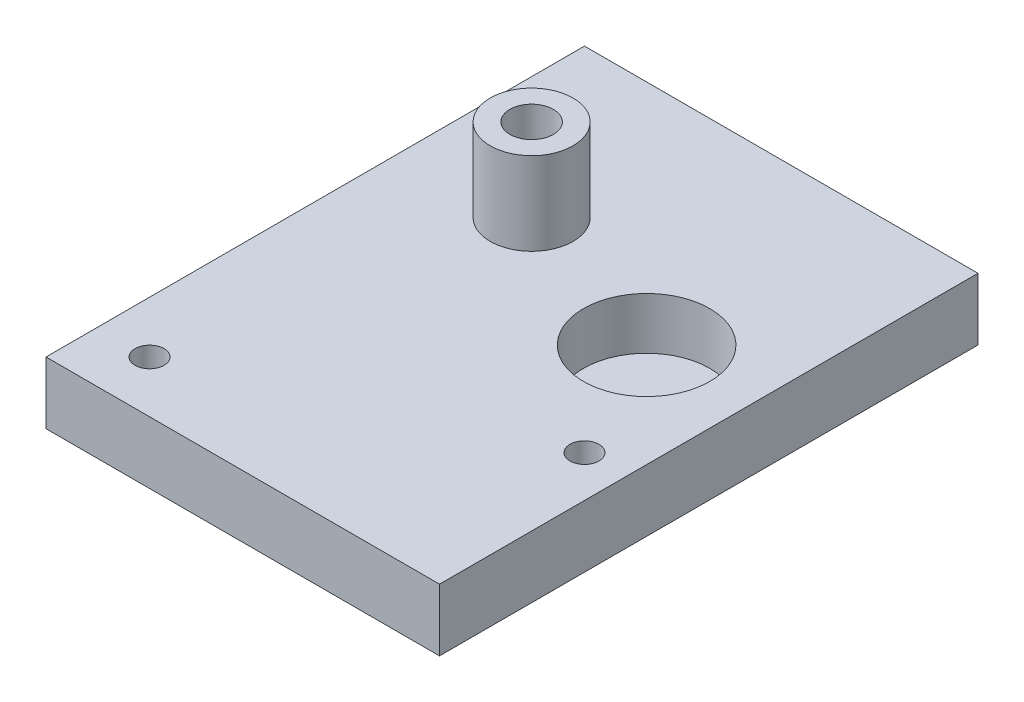
ISO-10303-21;
HEADER;
FILE_DESCRIPTION(('STEP AP214'),'2;1');
FILE_NAME('part.step','',(''),(''),'','','');
FILE_SCHEMA(('AUTOMOTIVE_DESIGN { 1 0 10303 214 1 1 1 1 }'));
ENDSEC;
DATA;
#1=APPLICATION_CONTEXT('core data for automotive mechanical design processes');
#2=APPLICATION_PROTOCOL_DEFINITION('international standard','automotive_design',2000,#1);
#3=PRODUCT_CONTEXT('',#1,'mechanical');
#4=PRODUCT('Part','Part','',(#3));
#5=PRODUCT_RELATED_PRODUCT_CATEGORY('part','',(#4));
#6=PRODUCT_DEFINITION_FORMATION('','',#4);
#7=PRODUCT_DEFINITION_CONTEXT('part definition',#1,'design');
#8=PRODUCT_DEFINITION('design','',#6,#7);
#9=PRODUCT_DEFINITION_SHAPE('','',#8);
#10=(LENGTH_UNIT() NAMED_UNIT(*) SI_UNIT(.MILLI.,.METRE.));
#11=(NAMED_UNIT(*) PLANE_ANGLE_UNIT() SI_UNIT($,.RADIAN.));
#12=(NAMED_UNIT(*) SI_UNIT($,.STERADIAN.) SOLID_ANGLE_UNIT());
#13=UNCERTAINTY_MEASURE_WITH_UNIT(LENGTH_MEASURE(1.E-05),#10,'distance_accuracy_value','');
#14=(GEOMETRIC_REPRESENTATION_CONTEXT(3) GLOBAL_UNCERTAINTY_ASSIGNED_CONTEXT((#13)) GLOBAL_UNIT_ASSIGNED_CONTEXT((#10,
#11,#12)) REPRESENTATION_CONTEXT('',''));
#15=CARTESIAN_POINT('',(0.,0.,0.));
#16=DIRECTION('',(0.,0.,1.));
#17=DIRECTION('',(1.,0.,0.));
#18=AXIS2_PLACEMENT_3D('',#15,#16,#17);
#19=CARTESIAN_POINT('',(-14.,3.,-11.));
#20=DIRECTION('',(0.,0.,-1.));
#21=DIRECTION('',(-1.,0.,0.));
#22=AXIS2_PLACEMENT_3D('',#19,#20,#21);
#23=PLANE('',#22);
#24=CARTESIAN_POINT('',(-4.2,1.5,-11.));
#25=DIRECTION('',(0.,0.,1.));
#26=DIRECTION('',(1.,0.,0.));
#27=AXIS2_PLACEMENT_3D('',#24,#25,#26);
#28=CIRCLE('',#27,0.300000000000001);
#29=CARTESIAN_POINT('',(-3.9,1.5,-11.));
#30=VERTEX_POINT('',#29);
#31=EDGE_CURVE('E178',#30,#30,#28,.T.);
#32=ORIENTED_EDGE('',*,*,#31,.T.);
#33=EDGE_LOOP('',(#32));
#34=FACE_BOUND('',#33,.T.);
#35=CARTESIAN_POINT('',(0.799999999999997,1.49999999999999,-11.));
#36=DIRECTION('',(0.,0.,1.));
#37=DIRECTION('',(1.,0.,0.));
#38=AXIS2_PLACEMENT_3D('',#35,#36,#37);
#39=CIRCLE('',#38,0.3);
#40=CARTESIAN_POINT('',(1.1,1.49999999999999,-11.));
#41=VERTEX_POINT('',#40);
#42=EDGE_CURVE('E181',#41,#41,#39,.T.);
#43=ORIENTED_EDGE('',*,*,#42,.T.);
#44=EDGE_LOOP('',(#43));
#45=FACE_BOUND('',#44,.T.);
#46=DIRECTION('',(1.,0.,0.));
#47=VECTOR('',#46,1.);
#48=CARTESIAN_POINT('',(-14.,0.,-11.));
#49=LINE('',#48,#47);
#50=CARTESIAN_POINT('',(-14.,0.,-11.));
#51=VERTEX_POINT('',#50);
#52=CARTESIAN_POINT('',(5.,0.,-11.));
#53=VERTEX_POINT('',#52);
#54=EDGE_CURVE('E104',#51,#53,#49,.T.);
#55=ORIENTED_EDGE('',*,*,#54,.F.);
#56=DIRECTION('',(0.,-1.,0.));
#57=VECTOR('',#56,1.);
#58=CARTESIAN_POINT('',(-14.,3.,-11.));
#59=LINE('',#58,#57);
#60=CARTESIAN_POINT('',(-14.,3.,-11.));
#61=VERTEX_POINT('',#60);
#62=EDGE_CURVE('E11',#61,#51,#59,.T.);
#63=ORIENTED_EDGE('',*,*,#62,.F.);
#64=DIRECTION('',(1.,0.,0.));
#65=VECTOR('',#64,1.);
#66=CARTESIAN_POINT('',(-14.,3.,-11.));
#67=LINE('',#66,#65);
#68=CARTESIAN_POINT('',(5.,3.,-11.));
#69=VERTEX_POINT('',#68);
#70=EDGE_CURVE('E98',#61,#69,#67,.T.);
#71=ORIENTED_EDGE('',*,*,#70,.T.);
#72=DIRECTION('',(0.,-1.,0.));
#73=VECTOR('',#72,1.);
#74=CARTESIAN_POINT('',(5.,3.,-11.));
#75=LINE('',#74,#73);
#76=EDGE_CURVE('E77',#69,#53,#75,.T.);
#77=ORIENTED_EDGE('',*,*,#76,.T.);
#78=EDGE_LOOP('',(#55,#63,#71,#77));
#79=FACE_BOUND('',#78,.T.);
#80=ADVANCED_FACE('F36',(#34,#45,#79),#23,.T.);
#81=CARTESIAN_POINT('',(-14.,3.,-11.));
#82=DIRECTION('',(1.,0.,0.));
#83=DIRECTION('',(0.,0.,-1.));
#84=AXIS2_PLACEMENT_3D('',#81,#82,#83);
#85=PLANE('',#84);
#86=DIRECTION('',(0.,0.,1.));
#87=VECTOR('',#86,1.);
#88=CARTESIAN_POINT('',(-14.,0.,-11.));
#89=LINE('',#88,#87);
#90=CARTESIAN_POINT('',(-14.,0.,15.));
#91=VERTEX_POINT('',#90);
#92=EDGE_CURVE('E69',#51,#91,#89,.T.);
#93=ORIENTED_EDGE('',*,*,#92,.T.);
#94=DIRECTION('',(0.,-1.,0.));
#95=VECTOR('',#94,1.);
#96=CARTESIAN_POINT('',(-14.,3.,15.));
#97=LINE('',#96,#95);
#98=CARTESIAN_POINT('',(-14.,3.,15.));
#99=VERTEX_POINT('',#98);
#100=EDGE_CURVE('E45',#99,#91,#97,.T.);
#101=ORIENTED_EDGE('',*,*,#100,.F.);
#102=DIRECTION('',(0.,0.,1.));
#103=VECTOR('',#102,1.);
#104=CARTESIAN_POINT('',(-14.,3.,-11.));
#105=LINE('',#104,#103);
#106=EDGE_CURVE('E87',#61,#99,#105,.T.);
#107=ORIENTED_EDGE('',*,*,#106,.F.);
#108=ORIENTED_EDGE('',*,*,#62,.T.);
#109=EDGE_LOOP('',(#93,#101,#107,#108));
#110=FACE_BOUND('',#109,.T.);
#111=ADVANCED_FACE('F169',(#110),#85,.F.);
#112=CARTESIAN_POINT('',(-14.,3.,15.));
#113=DIRECTION('',(0.,0.,-1.));
#114=DIRECTION('',(-1.,0.,0.));
#115=AXIS2_PLACEMENT_3D('',#112,#113,#114);
#116=PLANE('',#115);
#117=DIRECTION('',(1.,0.,0.));
#118=VECTOR('',#117,1.);
#119=CARTESIAN_POINT('',(-14.,0.,15.));
#120=LINE('',#119,#118);
#121=CARTESIAN_POINT('',(5.,0.,15.));
#122=VERTEX_POINT('',#121);
#123=EDGE_CURVE('E94',#91,#122,#120,.T.);
#124=ORIENTED_EDGE('',*,*,#123,.T.);
#125=DIRECTION('',(0.,-1.,0.));
#126=VECTOR('',#125,1.);
#127=CARTESIAN_POINT('',(5.,3.,15.));
#128=LINE('',#127,#126);
#129=CARTESIAN_POINT('',(5.,3.,15.));
#130=VERTEX_POINT('',#129);
#131=EDGE_CURVE('E91',#130,#122,#128,.T.);
#132=ORIENTED_EDGE('',*,*,#131,.F.);
#133=DIRECTION('',(1.,0.,0.));
#134=VECTOR('',#133,1.);
#135=CARTESIAN_POINT('',(-14.,3.,15.));
#136=LINE('',#135,#134);
#137=EDGE_CURVE('E82',#99,#130,#136,.T.);
#138=ORIENTED_EDGE('',*,*,#137,.F.);
#139=ORIENTED_EDGE('',*,*,#100,.T.);
#140=EDGE_LOOP('',(#124,#132,#138,#139));
#141=FACE_BOUND('',#140,.T.);
#142=ADVANCED_FACE('F92',(#141),#116,.F.);
#143=CARTESIAN_POINT('',(5.,3.,-11.));
#144=DIRECTION('',(1.,0.,0.));
#145=DIRECTION('',(0.,0.,-1.));
#146=AXIS2_PLACEMENT_3D('',#143,#144,#145);
#147=PLANE('',#146);
#148=DIRECTION('',(0.,0.,1.));
#149=VECTOR('',#148,1.);
#150=CARTESIAN_POINT('',(5.,0.,-11.));
#151=LINE('',#150,#149);
#152=EDGE_CURVE('E107',#53,#122,#151,.T.);
#153=ORIENTED_EDGE('',*,*,#152,.F.);
#154=ORIENTED_EDGE('',*,*,#76,.F.);
#155=DIRECTION('',(0.,0.,1.));
#156=VECTOR('',#155,1.);
#157=CARTESIAN_POINT('',(5.,3.,-11.));
#158=LINE('',#157,#156);
#159=EDGE_CURVE('E86',#69,#130,#158,.T.);
#160=ORIENTED_EDGE('',*,*,#159,.T.);
#161=ORIENTED_EDGE('',*,*,#131,.T.);
#162=EDGE_LOOP('',(#153,#154,#160,#161));
#163=FACE_BOUND('',#162,.T.);
#164=ADVANCED_FACE('F97',(#163),#147,.T.);
#165=CARTESIAN_POINT('',(0.,3.,0.));
#166=DIRECTION('',(0.,-1.,0.));
#167=DIRECTION('',(0.,0.,-1.));
#168=AXIS2_PLACEMENT_3D('',#165,#166,#167);
#169=PLANE('',#168);
#170=CARTESIAN_POINT('',(-8.10714951623889,3.,-2.55423701354193));
#171=DIRECTION('',(0.,-1.,0.));
#172=DIRECTION('',(0.,0.,-1.));
#173=AXIS2_PLACEMENT_3D('',#170,#171,#172);
#174=CIRCLE('',#173,2.);
#175=CARTESIAN_POINT('',(-8.10714951623889,3.,-4.55423701354193));
#176=VERTEX_POINT('',#175);
#177=EDGE_CURVE('E129',#176,#176,#174,.T.);
#178=ORIENTED_EDGE('',*,*,#177,.T.);
#179=EDGE_LOOP('',(#178));
#180=FACE_BOUND('',#179,.T.);
#181=CARTESIAN_POINT('',(-11.5,3.,12.5));
#182=DIRECTION('',(0.,-1.,0.));
#183=DIRECTION('',(0.,0.,-1.));
#184=AXIS2_PLACEMENT_3D('',#181,#182,#183);
#185=CIRCLE('',#184,0.699999999999999);
#186=CARTESIAN_POINT('',(-11.5,3.,11.8));
#187=VERTEX_POINT('',#186);
#188=EDGE_CURVE('E115',#187,#187,#185,.T.);
#189=ORIENTED_EDGE('',*,*,#188,.T.);
#190=EDGE_LOOP('',(#189));
#191=FACE_BOUND('',#190,.T.);
#192=CARTESIAN_POINT('',(3.,3.,6.));
#193=DIRECTION('',(0.,-1.,0.));
#194=DIRECTION('',(0.,0.,-1.));
#195=AXIS2_PLACEMENT_3D('',#192,#193,#194);
#196=CIRCLE('',#195,0.7);
#197=CARTESIAN_POINT('',(3.,3.,5.3));
#198=VERTEX_POINT('',#197);
#199=EDGE_CURVE('E121',#198,#198,#196,.T.);
#200=ORIENTED_EDGE('',*,*,#199,.T.);
#201=EDGE_LOOP('',(#200));
#202=FACE_BOUND('',#201,.T.);
#203=CARTESIAN_POINT('',(0.,3.,0.));
#204=DIRECTION('',(0.,-1.,0.));
#205=DIRECTION('',(0.,0.,-1.));
#206=AXIS2_PLACEMENT_3D('',#203,#204,#205);
#207=CIRCLE('',#206,3.05);
#208=CARTESIAN_POINT('',(0.,3.,-3.05));
#209=VERTEX_POINT('',#208);
#210=EDGE_CURVE('E146',#209,#209,#207,.T.);
#211=ORIENTED_EDGE('',*,*,#210,.T.);
#212=EDGE_LOOP('',(#211));
#213=FACE_BOUND('',#212,.T.);
#214=ORIENTED_EDGE('',*,*,#70,.F.);
#215=ORIENTED_EDGE('',*,*,#106,.T.);
#216=ORIENTED_EDGE('',*,*,#137,.T.);
#217=ORIENTED_EDGE('',*,*,#159,.F.);
#218=EDGE_LOOP('',(#214,#215,#216,#217));
#219=FACE_BOUND('',#218,.T.);
#220=ADVANCED_FACE('F85',(#180,#191,#202,#213,#219),#169,.F.);
#221=CARTESIAN_POINT('',(0.,0.,0.));
#222=DIRECTION('',(0.,-1.,0.));
#223=DIRECTION('',(0.,0.,-1.));
#224=AXIS2_PLACEMENT_3D('',#221,#222,#223);
#225=PLANE('',#224);
#226=CARTESIAN_POINT('',(-11.5,0.,12.5));
#227=DIRECTION('',(0.,-1.,0.));
#228=DIRECTION('',(0.,0.,-1.));
#229=AXIS2_PLACEMENT_3D('',#226,#227,#228);
#230=CIRCLE('',#229,0.999999999999999);
#231=CARTESIAN_POINT('',(-11.5,0.,11.5));
#232=VERTEX_POINT('',#231);
#233=EDGE_CURVE('E136',#232,#232,#230,.T.);
#234=ORIENTED_EDGE('',*,*,#233,.F.);
#235=EDGE_LOOP('',(#234));
#236=FACE_BOUND('',#235,.T.);
#237=CARTESIAN_POINT('',(3.,0.,6.));
#238=DIRECTION('',(0.,-1.,0.));
#239=DIRECTION('',(0.,0.,-1.));
#240=AXIS2_PLACEMENT_3D('',#237,#238,#239);
#241=CIRCLE('',#240,1.);
#242=CARTESIAN_POINT('',(3.,0.,5.));
#243=VERTEX_POINT('',#242);
#244=EDGE_CURVE('E139',#243,#243,#241,.T.);
#245=ORIENTED_EDGE('',*,*,#244,.F.);
#246=EDGE_LOOP('',(#245));
#247=FACE_BOUND('',#246,.T.);
#248=ORIENTED_EDGE('',*,*,#54,.T.);
#249=ORIENTED_EDGE('',*,*,#152,.T.);
#250=ORIENTED_EDGE('',*,*,#123,.F.);
#251=ORIENTED_EDGE('',*,*,#92,.F.);
#252=EDGE_LOOP('',(#248,#249,#250,#251));
#253=FACE_BOUND('',#252,.T.);
#254=ADVANCED_FACE('F165',(#236,#247,#253),#225,.T.);
#255=CARTESIAN_POINT('',(0.,0.5,0.));
#256=DIRECTION('',(0.,1.,0.));
#257=DIRECTION('',(0.,0.,1.));
#258=AXIS2_PLACEMENT_3D('',#255,#256,#257);
#259=CYLINDRICAL_SURFACE('',#258,3.05);
#260=CARTESIAN_POINT('',(0.,0.5,0.));
#261=DIRECTION('',(0.,-1.,0.));
#262=DIRECTION('',(0.,0.,-1.));
#263=AXIS2_PLACEMENT_3D('',#260,#261,#262);
#264=CIRCLE('',#263,3.05);
#265=CARTESIAN_POINT('',(0.,0.5,-3.05));
#266=VERTEX_POINT('',#265);
#267=EDGE_CURVE('E135',#266,#266,#264,.T.);
#268=ORIENTED_EDGE('',*,*,#267,.T.);
#269=EDGE_LOOP('',(#268));
#270=FACE_BOUND('',#269,.T.);
#271=ORIENTED_EDGE('',*,*,#210,.F.);
#272=EDGE_LOOP('',(#271));
#273=FACE_BOUND('',#272,.T.);
#274=ADVANCED_FACE('F151',(#270,#273),#259,.F.);
#275=CARTESIAN_POINT('',(0.,0.5,0.));
#276=DIRECTION('',(0.,-1.,0.));
#277=DIRECTION('',(0.,0.,-1.));
#278=AXIS2_PLACEMENT_3D('',#275,#276,#277);
#279=PLANE('',#278);
#280=ORIENTED_EDGE('',*,*,#267,.F.);
#281=EDGE_LOOP('',(#280));
#282=FACE_BOUND('',#281,.T.);
#283=ADVANCED_FACE('F154',(#282),#279,.F.);
#284=CARTESIAN_POINT('',(3.,1.5,6.));
#285=DIRECTION('',(0.,-1.,0.));
#286=DIRECTION('',(0.,0.,-1.));
#287=AXIS2_PLACEMENT_3D('',#284,#285,#286);
#288=CYLINDRICAL_SURFACE('',#287,1.);
#289=CARTESIAN_POINT('',(3.,1.5,6.));
#290=DIRECTION('',(0.,-1.,0.));
#291=DIRECTION('',(0.,0.,-1.));
#292=AXIS2_PLACEMENT_3D('',#289,#290,#291);
#293=CIRCLE('',#292,1.);
#294=CARTESIAN_POINT('',(3.,1.5,5.));
#295=VERTEX_POINT('',#294);
#296=EDGE_CURVE('E119',#295,#295,#293,.T.);
#297=ORIENTED_EDGE('',*,*,#296,.F.);
#298=EDGE_LOOP('',(#297));
#299=FACE_BOUND('',#298,.T.);
#300=ORIENTED_EDGE('',*,*,#244,.T.);
#301=EDGE_LOOP('',(#300));
#302=FACE_BOUND('',#301,.T.);
#303=ADVANCED_FACE('F156',(#299,#302),#288,.F.);
#304=CARTESIAN_POINT('',(3.,1.5,6.));
#305=DIRECTION('',(0.,-1.,0.));
#306=DIRECTION('',(0.,0.,-1.));
#307=AXIS2_PLACEMENT_3D('',#304,#305,#306);
#308=PLANE('',#307);
#309=CARTESIAN_POINT('',(3.,1.5,6.));
#310=DIRECTION('',(0.,-1.,0.));
#311=DIRECTION('',(0.,0.,-1.));
#312=AXIS2_PLACEMENT_3D('',#309,#310,#311);
#313=CIRCLE('',#312,0.7);
#314=CARTESIAN_POINT('',(3.,1.5,5.3));
#315=VERTEX_POINT('',#314);
#316=EDGE_CURVE('E39',#315,#315,#313,.T.);
#317=ORIENTED_EDGE('',*,*,#316,.F.);
#318=EDGE_LOOP('',(#317));
#319=FACE_BOUND('',#318,.T.);
#320=ORIENTED_EDGE('',*,*,#296,.T.);
#321=EDGE_LOOP('',(#320));
#322=FACE_BOUND('',#321,.T.);
#323=ADVANCED_FACE('F162',(#319,#322),#308,.T.);
#324=CARTESIAN_POINT('',(-11.5,1.5,12.5));
#325=DIRECTION('',(0.,-1.,0.));
#326=DIRECTION('',(0.,0.,-1.));
#327=AXIS2_PLACEMENT_3D('',#324,#325,#326);
#328=CYLINDRICAL_SURFACE('',#327,0.999999999999999);
#329=CARTESIAN_POINT('',(-11.5,1.5,12.5));
#330=DIRECTION('',(0.,-1.,0.));
#331=DIRECTION('',(0.,0.,-1.));
#332=AXIS2_PLACEMENT_3D('',#329,#330,#331);
#333=CIRCLE('',#332,0.999999999999999);
#334=CARTESIAN_POINT('',(-11.5,1.5,11.5));
#335=VERTEX_POINT('',#334);
#336=EDGE_CURVE('E132',#335,#335,#333,.T.);
#337=ORIENTED_EDGE('',*,*,#336,.F.);
#338=EDGE_LOOP('',(#337));
#339=FACE_BOUND('',#338,.T.);
#340=ORIENTED_EDGE('',*,*,#233,.T.);
#341=EDGE_LOOP('',(#340));
#342=FACE_BOUND('',#341,.T.);
#343=ADVANCED_FACE('F303',(#339,#342),#328,.F.);
#344=CARTESIAN_POINT('',(-11.5,1.5,12.5));
#345=DIRECTION('',(0.,-1.,0.));
#346=DIRECTION('',(0.,0.,-1.));
#347=AXIS2_PLACEMENT_3D('',#344,#345,#346);
#348=PLANE('',#347);
#349=CARTESIAN_POINT('',(-11.5,1.5,12.5));
#350=DIRECTION('',(0.,-1.,0.));
#351=DIRECTION('',(0.,0.,-1.));
#352=AXIS2_PLACEMENT_3D('',#349,#350,#351);
#353=CIRCLE('',#352,0.699999999999999);
#354=CARTESIAN_POINT('',(-11.5,1.5,11.8));
#355=VERTEX_POINT('',#354);
#356=EDGE_CURVE('E113',#355,#355,#353,.T.);
#357=ORIENTED_EDGE('',*,*,#356,.F.);
#358=EDGE_LOOP('',(#357));
#359=FACE_BOUND('',#358,.T.);
#360=ORIENTED_EDGE('',*,*,#336,.T.);
#361=EDGE_LOOP('',(#360));
#362=FACE_BOUND('',#361,.T.);
#363=ADVANCED_FACE('F298',(#359,#362),#348,.T.);
#364=CARTESIAN_POINT('',(-11.5,3.,12.5));
#365=DIRECTION('',(0.,-1.,0.));
#366=DIRECTION('',(0.,0.,-1.));
#367=AXIS2_PLACEMENT_3D('',#364,#365,#366);
#368=CYLINDRICAL_SURFACE('',#367,0.699999999999999);
#369=ORIENTED_EDGE('',*,*,#356,.T.);
#370=EDGE_LOOP('',(#369));
#371=FACE_BOUND('',#370,.T.);
#372=ORIENTED_EDGE('',*,*,#188,.F.);
#373=EDGE_LOOP('',(#372));
#374=FACE_BOUND('',#373,.T.);
#375=ADVANCED_FACE('F295',(#371,#374),#368,.F.);
#376=CARTESIAN_POINT('',(3.,3.,6.));
#377=DIRECTION('',(0.,-1.,0.));
#378=DIRECTION('',(0.,0.,-1.));
#379=AXIS2_PLACEMENT_3D('',#376,#377,#378);
#380=CYLINDRICAL_SURFACE('',#379,0.7);
#381=ORIENTED_EDGE('',*,*,#316,.T.);
#382=EDGE_LOOP('',(#381));
#383=FACE_BOUND('',#382,.T.);
#384=ORIENTED_EDGE('',*,*,#199,.F.);
#385=EDGE_LOOP('',(#384));
#386=FACE_BOUND('',#385,.T.);
#387=ADVANCED_FACE('F211',(#383,#386),#380,.F.);
#388=CARTESIAN_POINT('',(-8.10714951623889,7.,-2.55423701354193));
#389=DIRECTION('',(0.,-1.,0.));
#390=DIRECTION('',(0.,0.,-1.));
#391=AXIS2_PLACEMENT_3D('',#388,#389,#390);
#392=CYLINDRICAL_SURFACE('',#391,2.);
#393=CARTESIAN_POINT('',(-8.10714951623889,7.,-2.55423701354193));
#394=DIRECTION('',(0.,-1.,0.));
#395=DIRECTION('',(0.,0.,-1.));
#396=AXIS2_PLACEMENT_3D('',#393,#394,#395);
#397=CIRCLE('',#396,2.);
#398=CARTESIAN_POINT('',(-8.10714951623889,7.,-4.55423701354193));
#399=VERTEX_POINT('',#398);
#400=EDGE_CURVE('E126',#399,#399,#397,.T.);
#401=ORIENTED_EDGE('',*,*,#400,.T.);
#402=EDGE_LOOP('',(#401));
#403=FACE_BOUND('',#402,.T.);
#404=ORIENTED_EDGE('',*,*,#177,.F.);
#405=EDGE_LOOP('',(#404));
#406=FACE_BOUND('',#405,.T.);
#407=ADVANCED_FACE('F216',(#403,#406),#392,.T.);
#408=CARTESIAN_POINT('',(-8.10714951623889,7.,-2.55423701354193));
#409=DIRECTION('',(0.,-1.,0.));
#410=DIRECTION('',(0.,0.,-1.));
#411=AXIS2_PLACEMENT_3D('',#408,#409,#410);
#412=PLANE('',#411);
#413=CARTESIAN_POINT('',(-8.10714951623889,7.,-2.55423701354193));
#414=DIRECTION('',(0.,-1.,0.));
#415=DIRECTION('',(0.,0.,-1.));
#416=AXIS2_PLACEMENT_3D('',#413,#414,#415);
#417=CIRCLE('',#416,1.05);
#418=CARTESIAN_POINT('',(-8.10714951623889,7.,-3.60423701354193));
#419=VERTEX_POINT('',#418);
#420=EDGE_CURVE('E318',#419,#419,#417,.T.);
#421=ORIENTED_EDGE('',*,*,#420,.T.);
#422=EDGE_LOOP('',(#421));
#423=FACE_BOUND('',#422,.T.);
#424=ORIENTED_EDGE('',*,*,#400,.F.);
#425=EDGE_LOOP('',(#424));
#426=FACE_BOUND('',#425,.T.);
#427=ADVANCED_FACE('F221',(#423,#426),#412,.F.);
#428=CARTESIAN_POINT('',(-8.10714951623889,0.5,-2.55423701354193));
#429=DIRECTION('',(0.,-1.,0.));
#430=DIRECTION('',(0.,0.,-1.));
#431=AXIS2_PLACEMENT_3D('',#428,#429,#430);
#432=PLANE('',#431);
#433=CARTESIAN_POINT('',(-8.10714951623889,0.5,-2.55423701354193));
#434=DIRECTION('',(0.,-1.,0.));
#435=DIRECTION('',(0.,0.,-1.));
#436=AXIS2_PLACEMENT_3D('',#433,#434,#435);
#437=CIRCLE('',#436,1.05);
#438=CARTESIAN_POINT('',(-8.10714951623889,0.5,-3.60423701354193));
#439=VERTEX_POINT('',#438);
#440=EDGE_CURVE('E108',#439,#439,#437,.T.);
#441=ORIENTED_EDGE('',*,*,#440,.F.);
#442=EDGE_LOOP('',(#441));
#443=FACE_BOUND('',#442,.T.);
#444=ADVANCED_FACE('F231',(#443),#432,.F.);
#445=CARTESIAN_POINT('',(-8.10714951623889,0.5,-2.55423701354193));
#446=DIRECTION('',(0.,1.,0.));
#447=DIRECTION('',(0.,0.,1.));
#448=AXIS2_PLACEMENT_3D('',#445,#446,#447);
#449=CYLINDRICAL_SURFACE('',#448,1.05);
#450=ORIENTED_EDGE('',*,*,#440,.T.);
#451=EDGE_LOOP('',(#450));
#452=FACE_BOUND('',#451,.T.);
#453=ORIENTED_EDGE('',*,*,#420,.F.);
#454=EDGE_LOOP('',(#453));
#455=FACE_BOUND('',#454,.T.);
#456=ADVANCED_FACE('F239',(#452,#455),#449,.F.);
#457=CARTESIAN_POINT('',(0.799999999999997,1.49999999999999,-9.5));
#458=DIRECTION('',(0.,0.,-1.));
#459=DIRECTION('',(-1.,0.,0.));
#460=AXIS2_PLACEMENT_3D('',#457,#458,#459);
#461=CYLINDRICAL_SURFACE('',#460,0.3);
#462=CARTESIAN_POINT('',(0.799999999999997,1.49999999999999,-9.5));
#463=DIRECTION('',(0.,0.,1.));
#464=DIRECTION('',(1.,0.,0.));
#465=AXIS2_PLACEMENT_3D('',#462,#463,#464);
#466=CIRCLE('',#465,0.3);
#467=CARTESIAN_POINT('',(1.1,1.49999999999999,-9.5));
#468=VERTEX_POINT('',#467);
#469=EDGE_CURVE('E325',#468,#468,#466,.T.);
#470=ORIENTED_EDGE('',*,*,#469,.T.);
#471=EDGE_LOOP('',(#470));
#472=FACE_BOUND('',#471,.T.);
#473=ORIENTED_EDGE('',*,*,#42,.F.);
#474=EDGE_LOOP('',(#473));
#475=FACE_BOUND('',#474,.T.);
#476=ADVANCED_FACE('F242',(#472,#475),#461,.F.);
#477=CARTESIAN_POINT('',(0.799999999999997,1.49999999999999,-9.5));
#478=DIRECTION('',(0.,0.,1.));
#479=DIRECTION('',(1.,0.,0.));
#480=AXIS2_PLACEMENT_3D('',#477,#478,#479);
#481=PLANE('',#480);
#482=ORIENTED_EDGE('',*,*,#469,.F.);
#483=EDGE_LOOP('',(#482));
#484=FACE_BOUND('',#483,.T.);
#485=ADVANCED_FACE('F259',(#484),#481,.F.);
#486=CARTESIAN_POINT('',(-4.2,1.5,-9.5));
#487=DIRECTION('',(0.,0.,-1.));
#488=DIRECTION('',(-1.,0.,0.));
#489=AXIS2_PLACEMENT_3D('',#486,#487,#488);
#490=CYLINDRICAL_SURFACE('',#489,0.300000000000001);
#491=CARTESIAN_POINT('',(-4.2,1.5,-9.5));
#492=DIRECTION('',(0.,0.,1.));
#493=DIRECTION('',(1.,0.,0.));
#494=AXIS2_PLACEMENT_3D('',#491,#492,#493);
#495=CIRCLE('',#494,0.300000000000001);
#496=CARTESIAN_POINT('',(-3.9,1.5,-9.5));
#497=VERTEX_POINT('',#496);
#498=EDGE_CURVE('E319',#497,#497,#495,.T.);
#499=ORIENTED_EDGE('',*,*,#498,.T.);
#500=EDGE_LOOP('',(#499));
#501=FACE_BOUND('',#500,.T.);
#502=ORIENTED_EDGE('',*,*,#31,.F.);
#503=EDGE_LOOP('',(#502));
#504=FACE_BOUND('',#503,.T.);
#505=ADVANCED_FACE('F269',(#501,#504),#490,.F.);
#506=CARTESIAN_POINT('',(-4.2,1.5,-9.5));
#507=DIRECTION('',(0.,0.,1.));
#508=DIRECTION('',(1.,0.,0.));
#509=AXIS2_PLACEMENT_3D('',#506,#507,#508);
#510=PLANE('',#509);
#511=ORIENTED_EDGE('',*,*,#498,.F.);
#512=EDGE_LOOP('',(#511));
#513=FACE_BOUND('',#512,.T.);
#514=ADVANCED_FACE('F279',(#513),#510,.F.);
#515=CLOSED_SHELL('',(#80,#111,#142,#164,#220,#254,#274,#283,#303,#323,#343,#363,#375,#387,#407,
#427,#444,#456,#476,#485,#505,#514));
#516=MANIFOLD_SOLID_BREP('B2',#515);
#517=ADVANCED_BREP_SHAPE_REPRESENTATION('',(#18,#516),#14);
#518=SHAPE_DEFINITION_REPRESENTATION(#9,#517);
ENDSEC;
END-ISO-10303-21;
